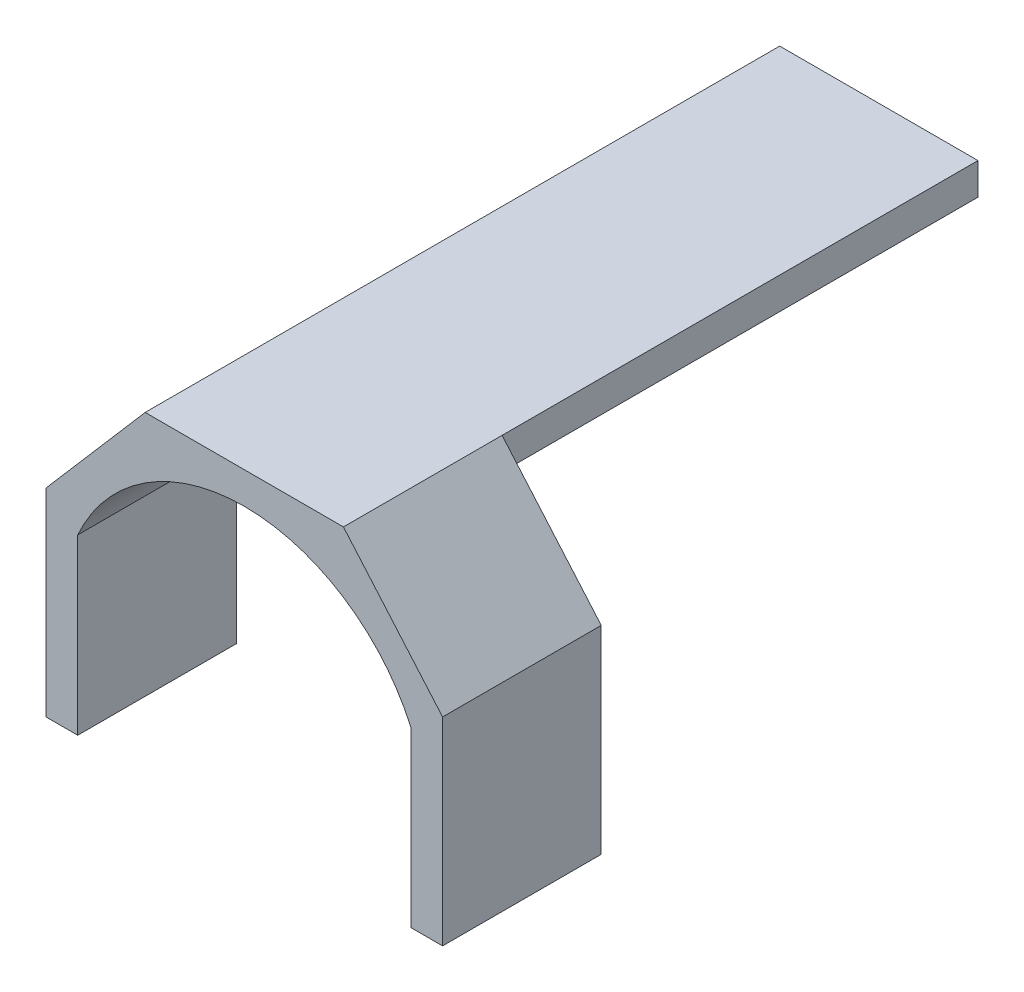
ISO-10303-21;
HEADER;
FILE_DESCRIPTION(('STEP AP214'),'2;1');
FILE_NAME('part.step','',(''),(''),'','','');
FILE_SCHEMA(('AUTOMOTIVE_DESIGN { 1 0 10303 214 1 1 1 1 }'));
ENDSEC;
DATA;
#1=APPLICATION_CONTEXT('core data for automotive mechanical design processes');
#2=APPLICATION_PROTOCOL_DEFINITION('international standard','automotive_design',2000,#1);
#3=PRODUCT_CONTEXT('',#1,'mechanical');
#4=PRODUCT('Part','Part','',(#3));
#5=PRODUCT_RELATED_PRODUCT_CATEGORY('part','',(#4));
#6=PRODUCT_DEFINITION_FORMATION('','',#4);
#7=PRODUCT_DEFINITION_CONTEXT('part definition',#1,'design');
#8=PRODUCT_DEFINITION('design','',#6,#7);
#9=PRODUCT_DEFINITION_SHAPE('','',#8);
#10=(LENGTH_UNIT() NAMED_UNIT(*) SI_UNIT(.MILLI.,.METRE.));
#11=(NAMED_UNIT(*) PLANE_ANGLE_UNIT() SI_UNIT($,.RADIAN.));
#12=(NAMED_UNIT(*) SI_UNIT($,.STERADIAN.) SOLID_ANGLE_UNIT());
#13=UNCERTAINTY_MEASURE_WITH_UNIT(LENGTH_MEASURE(1.E-05),#10,'distance_accuracy_value','');
#14=(GEOMETRIC_REPRESENTATION_CONTEXT(3) GLOBAL_UNCERTAINTY_ASSIGNED_CONTEXT((#13)) GLOBAL_UNIT_ASSIGNED_CONTEXT((#10,
#11,#12)) REPRESENTATION_CONTEXT('',''));
#15=CARTESIAN_POINT('',(0.,0.,0.));
#16=DIRECTION('',(0.,0.,1.));
#17=DIRECTION('',(1.,0.,0.));
#18=AXIS2_PLACEMENT_3D('',#15,#16,#17);
#19=CARTESIAN_POINT('',(-25.,4.,0.));
#20=DIRECTION('',(-1.,0.,0.));
#21=DIRECTION('',(0.,0.,1.));
#22=AXIS2_PLACEMENT_3D('',#19,#20,#21);
#23=PLANE('',#22);
#24=DIRECTION('',(0.,0.,1.));
#25=VECTOR('',#24,1.);
#26=CARTESIAN_POINT('',(-25.,-4.,0.));
#27=LINE('',#26,#25);
#28=CARTESIAN_POINT('',(-25.,-4.,0.));
#29=VERTEX_POINT('',#28);
#30=CARTESIAN_POINT('',(-25.,-4.,120.));
#31=VERTEX_POINT('',#30);
#32=EDGE_CURVE('E161',#29,#31,#27,.T.);
#33=ORIENTED_EDGE('',*,*,#32,.T.);
#34=DIRECTION('',(0.,1.,0.));
#35=VECTOR('',#34,1.);
#36=CARTESIAN_POINT('',(-25.,4.,120.));
#37=LINE('',#36,#35);
#38=CARTESIAN_POINT('',(-25.,4.,120.));
#39=VERTEX_POINT('',#38);
#40=EDGE_CURVE('E149',#31,#39,#37,.T.);
#41=ORIENTED_EDGE('',*,*,#40,.T.);
#42=DIRECTION('',(0.,0.,1.));
#43=VECTOR('',#42,1.);
#44=CARTESIAN_POINT('',(-25.,4.,0.));
#45=LINE('',#44,#43);
#46=CARTESIAN_POINT('',(-25.,4.,0.));
#47=VERTEX_POINT('',#46);
#48=EDGE_CURVE('E159',#47,#39,#45,.T.);
#49=ORIENTED_EDGE('',*,*,#48,.F.);
#50=DIRECTION('',(0.,-1.,0.));
#51=VECTOR('',#50,1.);
#52=CARTESIAN_POINT('',(-25.,4.,0.));
#53=LINE('',#52,#51);
#54=EDGE_CURVE('E69',#47,#29,#53,.T.);
#55=ORIENTED_EDGE('',*,*,#54,.T.);
#56=EDGE_LOOP('',(#33,#41,#49,#55));
#57=FACE_BOUND('',#56,.T.);
#58=ADVANCED_FACE('F35',(#57),#23,.T.);
#59=CARTESIAN_POINT('',(-25.,-4.,0.));
#60=DIRECTION('',(0.,-1.,0.));
#61=DIRECTION('',(1.,0.,0.));
#62=AXIS2_PLACEMENT_3D('',#59,#60,#61);
#63=PLANE('',#62);
#64=DIRECTION('',(0.,0.,1.));
#65=VECTOR('',#64,1.);
#66=CARTESIAN_POINT('',(25.,-4.,0.));
#67=LINE('',#66,#65);
#68=CARTESIAN_POINT('',(25.,-4.,0.));
#69=VERTEX_POINT('',#68);
#70=CARTESIAN_POINT('',(25.,-4.,120.));
#71=VERTEX_POINT('',#70);
#72=EDGE_CURVE('E169',#69,#71,#67,.T.);
#73=ORIENTED_EDGE('',*,*,#72,.T.);
#74=DIRECTION('',(-1.,0.,0.));
#75=VECTOR('',#74,1.);
#76=CARTESIAN_POINT('',(-25.,-4.,120.));
#77=LINE('',#76,#75);
#78=CARTESIAN_POINT('',(0.,-4.,120.));
#79=VERTEX_POINT('',#78);
#80=EDGE_CURVE('E190',#71,#79,#77,.T.);
#81=ORIENTED_EDGE('',*,*,#80,.T.);
#82=EDGE_CURVE('E162',#79,#31,#77,.T.);
#83=ORIENTED_EDGE('',*,*,#82,.T.);
#84=ORIENTED_EDGE('',*,*,#32,.F.);
#85=DIRECTION('',(1.,0.,0.));
#86=VECTOR('',#85,1.);
#87=CARTESIAN_POINT('',(-25.,-4.,0.));
#88=LINE('',#87,#86);
#89=EDGE_CURVE('E66',#29,#69,#88,.T.);
#90=ORIENTED_EDGE('',*,*,#89,.T.);
#91=EDGE_LOOP('',(#73,#81,#83,#84,#90));
#92=FACE_BOUND('',#91,.T.);
#93=ADVANCED_FACE('F212',(#92),#63,.T.);
#94=CARTESIAN_POINT('',(25.,4.,0.));
#95=DIRECTION('',(1.,0.,0.));
#96=DIRECTION('',(0.,0.,-1.));
#97=AXIS2_PLACEMENT_3D('',#94,#95,#96);
#98=PLANE('',#97);
#99=DIRECTION('',(0.,0.,1.));
#100=VECTOR('',#99,1.);
#101=CARTESIAN_POINT('',(25.,4.,0.));
#102=LINE('',#101,#100);
#103=CARTESIAN_POINT('',(25.,4.,0.));
#104=VERTEX_POINT('',#103);
#105=CARTESIAN_POINT('',(25.,4.,120.));
#106=VERTEX_POINT('',#105);
#107=EDGE_CURVE('E44',#104,#106,#102,.T.);
#108=ORIENTED_EDGE('',*,*,#107,.T.);
#109=DIRECTION('',(0.,-1.,0.));
#110=VECTOR('',#109,1.);
#111=CARTESIAN_POINT('',(25.,4.,120.));
#112=LINE('',#111,#110);
#113=EDGE_CURVE('E182',#106,#71,#112,.T.);
#114=ORIENTED_EDGE('',*,*,#113,.T.);
#115=ORIENTED_EDGE('',*,*,#72,.F.);
#116=DIRECTION('',(0.,1.,0.));
#117=VECTOR('',#116,1.);
#118=CARTESIAN_POINT('',(25.,4.,0.));
#119=LINE('',#118,#117);
#120=EDGE_CURVE('E62',#69,#104,#119,.T.);
#121=ORIENTED_EDGE('',*,*,#120,.T.);
#122=EDGE_LOOP('',(#108,#114,#115,#121));
#123=FACE_BOUND('',#122,.T.);
#124=ADVANCED_FACE('F180',(#123),#98,.T.);
#125=CARTESIAN_POINT('',(0.,0.,0.));
#126=DIRECTION('',(0.,0.,1.));
#127=DIRECTION('',(1.,0.,0.));
#128=AXIS2_PLACEMENT_3D('',#125,#126,#127);
#129=PLANE('',#128);
#130=ORIENTED_EDGE('',*,*,#54,.F.);
#131=DIRECTION('',(-1.,0.,0.));
#132=VECTOR('',#131,1.);
#133=CARTESIAN_POINT('',(-25.,4.,0.));
#134=LINE('',#133,#132);
#135=EDGE_CURVE('E167',#104,#47,#134,.T.);
#136=ORIENTED_EDGE('',*,*,#135,.F.);
#137=ORIENTED_EDGE('',*,*,#120,.F.);
#138=ORIENTED_EDGE('',*,*,#89,.F.);
#139=EDGE_LOOP('',(#130,#136,#137,#138));
#140=FACE_BOUND('',#139,.T.);
#141=ADVANCED_FACE('F37',(#140),#129,.F.);
#142=CARTESIAN_POINT('',(0.,0.,160.));
#143=DIRECTION('',(0.,0.,1.));
#144=DIRECTION('',(1.,0.,0.));
#145=AXIS2_PLACEMENT_3D('',#142,#143,#144);
#146=PLANE('',#145);
#147=CARTESIAN_POINT('',(0.,-50.,160.));
#148=DIRECTION('',(0.,0.,-1.));
#149=DIRECTION('',(1.,0.,0.));
#150=AXIS2_PLACEMENT_3D('',#147,#148,#149);
#151=CIRCLE('',#150,46.);
#152=CARTESIAN_POINT('',(-42.,-31.2383369607063,160.));
#153=VERTEX_POINT('',#152);
#154=CARTESIAN_POINT('',(42.,-31.2383369607063,160.));
#155=VERTEX_POINT('',#154);
#156=EDGE_CURVE('E253',#153,#155,#151,.T.);
#157=ORIENTED_EDGE('',*,*,#156,.T.);
#158=DIRECTION('',(0.,-1.,0.));
#159=VECTOR('',#158,1.);
#160=CARTESIAN_POINT('',(42.,-31.2383369607063,160.));
#161=LINE('',#160,#159);
#162=CARTESIAN_POINT('',(42.,-75.,160.));
#163=VERTEX_POINT('',#162);
#164=EDGE_CURVE('E255',#155,#163,#161,.T.);
#165=ORIENTED_EDGE('',*,*,#164,.T.);
#166=DIRECTION('',(1.,0.,0.));
#167=VECTOR('',#166,1.);
#168=CARTESIAN_POINT('',(42.,-75.,160.));
#169=LINE('',#168,#167);
#170=CARTESIAN_POINT('',(50.,-75.,160.));
#171=VERTEX_POINT('',#170);
#172=EDGE_CURVE('E258',#163,#171,#169,.T.);
#173=ORIENTED_EDGE('',*,*,#172,.T.);
#174=DIRECTION('',(0.,1.,0.));
#175=VECTOR('',#174,1.);
#176=CARTESIAN_POINT('',(50.,-25.,160.));
#177=LINE('',#176,#175);
#178=CARTESIAN_POINT('',(50.,-25.,160.));
#179=VERTEX_POINT('',#178);
#180=EDGE_CURVE('E260',#171,#179,#177,.T.);
#181=ORIENTED_EDGE('',*,*,#180,.T.);
#182=DIRECTION('',(-0.652939622069463,0.757409961600577,0.));
#183=VECTOR('',#182,1.);
#184=CARTESIAN_POINT('',(25.,4.,160.));
#185=LINE('',#184,#183);
#186=CARTESIAN_POINT('',(25.,4.,160.));
#187=VERTEX_POINT('',#186);
#188=EDGE_CURVE('E154',#179,#187,#185,.T.);
#189=ORIENTED_EDGE('',*,*,#188,.T.);
#190=DIRECTION('',(-1.,0.,0.));
#191=VECTOR('',#190,1.);
#192=CARTESIAN_POINT('',(-25.,4.,160.));
#193=LINE('',#192,#191);
#194=CARTESIAN_POINT('',(-25.,4.,160.));
#195=VERTEX_POINT('',#194);
#196=EDGE_CURVE('E11',#187,#195,#193,.T.);
#197=ORIENTED_EDGE('',*,*,#196,.T.);
#198=DIRECTION('',(-0.652939622069463,-0.757409961600577,0.));
#199=VECTOR('',#198,1.);
#200=CARTESIAN_POINT('',(-50.,-25.,160.));
#201=LINE('',#200,#199);
#202=CARTESIAN_POINT('',(-50.,-25.,160.));
#203=VERTEX_POINT('',#202);
#204=EDGE_CURVE('E51',#195,#203,#201,.T.);
#205=ORIENTED_EDGE('',*,*,#204,.T.);
#206=DIRECTION('',(0.,-1.,0.));
#207=VECTOR('',#206,1.);
#208=CARTESIAN_POINT('',(-50.,-25.,160.));
#209=LINE('',#208,#207);
#210=CARTESIAN_POINT('',(-50.,-75.,160.));
#211=VERTEX_POINT('',#210);
#212=EDGE_CURVE('E244',#203,#211,#209,.T.);
#213=ORIENTED_EDGE('',*,*,#212,.T.);
#214=DIRECTION('',(1.,0.,0.));
#215=VECTOR('',#214,1.);
#216=CARTESIAN_POINT('',(-50.,-75.,160.));
#217=LINE('',#216,#215);
#218=CARTESIAN_POINT('',(-42.,-75.,160.));
#219=VERTEX_POINT('',#218);
#220=EDGE_CURVE('E247',#211,#219,#217,.T.);
#221=ORIENTED_EDGE('',*,*,#220,.T.);
#222=DIRECTION('',(0.,1.,0.));
#223=VECTOR('',#222,1.);
#224=CARTESIAN_POINT('',(-42.,-31.2383369607063,160.));
#225=LINE('',#224,#223);
#226=EDGE_CURVE('E250',#219,#153,#225,.T.);
#227=ORIENTED_EDGE('',*,*,#226,.T.);
#228=EDGE_LOOP('',(#157,#165,#173,#181,#189,#197,#205,#213,#221,#227));
#229=FACE_BOUND('',#228,.T.);
#230=ADVANCED_FACE('F264',(#229),#146,.T.);
#231=CARTESIAN_POINT('',(-25.,4.,0.));
#232=DIRECTION('',(0.,1.,0.));
#233=DIRECTION('',(0.,0.,1.));
#234=AXIS2_PLACEMENT_3D('',#231,#232,#233);
#235=PLANE('',#234);
#236=DIRECTION('',(0.,0.,1.));
#237=VECTOR('',#236,1.);
#238=CARTESIAN_POINT('',(25.,4.,120.));
#239=LINE('',#238,#237);
#240=EDGE_CURVE('E183',#106,#187,#239,.T.);
#241=ORIENTED_EDGE('',*,*,#240,.F.);
#242=ORIENTED_EDGE('',*,*,#107,.F.);
#243=ORIENTED_EDGE('',*,*,#135,.T.);
#244=ORIENTED_EDGE('',*,*,#48,.T.);
#245=DIRECTION('',(0.,0.,1.));
#246=VECTOR('',#245,1.);
#247=CARTESIAN_POINT('',(-25.,4.,120.));
#248=LINE('',#247,#246);
#249=EDGE_CURVE('E135',#39,#195,#248,.T.);
#250=ORIENTED_EDGE('',*,*,#249,.T.);
#251=ORIENTED_EDGE('',*,*,#196,.F.);
#252=EDGE_LOOP('',(#241,#242,#243,#244,#250,#251));
#253=FACE_BOUND('',#252,.T.);
#254=ADVANCED_FACE('F165',(#253),#235,.T.);
#255=CARTESIAN_POINT('',(0.,-50.,120.));
#256=DIRECTION('',(0.,0.,1.));
#257=DIRECTION('',(1.,0.,0.));
#258=AXIS2_PLACEMENT_3D('',#255,#256,#257);
#259=CYLINDRICAL_SURFACE('',#258,46.);
#260=CARTESIAN_POINT('',(0.,-50.,120.));
#261=DIRECTION('',(0.,0.,-1.));
#262=DIRECTION('',(1.,0.,0.));
#263=AXIS2_PLACEMENT_3D('',#260,#261,#262);
#264=CIRCLE('',#263,46.);
#265=CARTESIAN_POINT('',(-42.,-31.2383369607063,120.));
#266=VERTEX_POINT('',#265);
#267=EDGE_CURVE('E217',#266,#79,#264,.T.);
#268=ORIENTED_EDGE('',*,*,#267,.T.);
#269=CARTESIAN_POINT('',(42.,-31.2383369607063,120.));
#270=VERTEX_POINT('',#269);
#271=EDGE_CURVE('E221',#79,#270,#264,.T.);
#272=ORIENTED_EDGE('',*,*,#271,.T.);
#273=DIRECTION('',(0.,0.,1.));
#274=VECTOR('',#273,1.);
#275=CARTESIAN_POINT('',(42.,-31.2383369607063,120.));
#276=LINE('',#275,#274);
#277=EDGE_CURVE('E200',#270,#155,#276,.T.);
#278=ORIENTED_EDGE('',*,*,#277,.T.);
#279=ORIENTED_EDGE('',*,*,#156,.F.);
#280=DIRECTION('',(0.,0.,1.));
#281=VECTOR('',#280,1.);
#282=CARTESIAN_POINT('',(-42.,-31.2383369607063,120.));
#283=LINE('',#282,#281);
#284=EDGE_CURVE('E203',#266,#153,#283,.T.);
#285=ORIENTED_EDGE('',*,*,#284,.F.);
#286=EDGE_LOOP('',(#268,#272,#278,#279,#285));
#287=FACE_BOUND('',#286,.T.);
#288=ADVANCED_FACE('F230',(#287),#259,.F.);
#289=CARTESIAN_POINT('',(0.,-50.,120.));
#290=DIRECTION('',(0.,0.,1.));
#291=DIRECTION('',(1.,0.,0.));
#292=AXIS2_PLACEMENT_3D('',#289,#290,#291);
#293=PLANE('',#292);
#294=ORIENTED_EDGE('',*,*,#40,.F.);
#295=ORIENTED_EDGE('',*,*,#82,.F.);
#296=ORIENTED_EDGE('',*,*,#267,.F.);
#297=DIRECTION('',(0.,1.,0.));
#298=VECTOR('',#297,1.);
#299=CARTESIAN_POINT('',(-42.,-31.2383369607063,120.));
#300=LINE('',#299,#298);
#301=CARTESIAN_POINT('',(-42.,-75.,120.));
#302=VERTEX_POINT('',#301);
#303=EDGE_CURVE('E228',#302,#266,#300,.T.);
#304=ORIENTED_EDGE('',*,*,#303,.F.);
#305=DIRECTION('',(1.,0.,0.));
#306=VECTOR('',#305,1.);
#307=CARTESIAN_POINT('',(-50.,-75.,120.));
#308=LINE('',#307,#306);
#309=CARTESIAN_POINT('',(-50.,-75.,120.));
#310=VERTEX_POINT('',#309);
#311=EDGE_CURVE('E281',#310,#302,#308,.T.);
#312=ORIENTED_EDGE('',*,*,#311,.F.);
#313=DIRECTION('',(0.,-1.,0.));
#314=VECTOR('',#313,1.);
#315=CARTESIAN_POINT('',(-50.,-25.,120.));
#316=LINE('',#315,#314);
#317=CARTESIAN_POINT('',(-50.,-25.,120.));
#318=VERTEX_POINT('',#317);
#319=EDGE_CURVE('E153',#318,#310,#316,.T.);
#320=ORIENTED_EDGE('',*,*,#319,.F.);
#321=DIRECTION('',(-0.652939622069463,-0.757409961600577,0.));
#322=VECTOR('',#321,1.);
#323=CARTESIAN_POINT('',(-50.,-25.,120.));
#324=LINE('',#323,#322);
#325=EDGE_CURVE('E138',#39,#318,#324,.T.);
#326=ORIENTED_EDGE('',*,*,#325,.F.);
#327=EDGE_LOOP('',(#294,#295,#296,#304,#312,#320,#326));
#328=FACE_BOUND('',#327,.T.);
#329=ADVANCED_FACE('F148',(#328),#293,.F.);
#330=CARTESIAN_POINT('',(25.,4.,120.));
#331=DIRECTION('',(0.757409961600577,0.652939622069463,0.));
#332=DIRECTION('',(-0.652939622069463,0.757409961600577,0.));
#333=AXIS2_PLACEMENT_3D('',#330,#331,#332);
#334=PLANE('',#333);
#335=ORIENTED_EDGE('',*,*,#188,.F.);
#336=DIRECTION('',(0.,0.,1.));
#337=VECTOR('',#336,1.);
#338=CARTESIAN_POINT('',(50.,-25.,120.));
#339=LINE('',#338,#337);
#340=CARTESIAN_POINT('',(50.,-25.,120.));
#341=VERTEX_POINT('',#340);
#342=EDGE_CURVE('E188',#341,#179,#339,.T.);
#343=ORIENTED_EDGE('',*,*,#342,.F.);
#344=DIRECTION('',(-0.652939622069463,0.757409961600577,0.));
#345=VECTOR('',#344,1.);
#346=CARTESIAN_POINT('',(25.,4.,120.));
#347=LINE('',#346,#345);
#348=EDGE_CURVE('E143',#341,#106,#347,.T.);
#349=ORIENTED_EDGE('',*,*,#348,.T.);
#350=ORIENTED_EDGE('',*,*,#240,.T.);
#351=EDGE_LOOP('',(#335,#343,#349,#350));
#352=FACE_BOUND('',#351,.T.);
#353=ADVANCED_FACE('F265',(#352),#334,.T.);
#354=CARTESIAN_POINT('',(50.,-25.,120.));
#355=DIRECTION('',(1.,0.,0.));
#356=DIRECTION('',(0.,1.,0.));
#357=AXIS2_PLACEMENT_3D('',#354,#355,#356);
#358=PLANE('',#357);
#359=ORIENTED_EDGE('',*,*,#180,.F.);
#360=DIRECTION('',(0.,0.,1.));
#361=VECTOR('',#360,1.);
#362=CARTESIAN_POINT('',(50.,-75.,120.));
#363=LINE('',#362,#361);
#364=CARTESIAN_POINT('',(50.,-75.,120.));
#365=VERTEX_POINT('',#364);
#366=EDGE_CURVE('E192',#365,#171,#363,.T.);
#367=ORIENTED_EDGE('',*,*,#366,.F.);
#368=DIRECTION('',(0.,1.,0.));
#369=VECTOR('',#368,1.);
#370=CARTESIAN_POINT('',(50.,-25.,120.));
#371=LINE('',#370,#369);
#372=EDGE_CURVE('E239',#365,#341,#371,.T.);
#373=ORIENTED_EDGE('',*,*,#372,.T.);
#374=ORIENTED_EDGE('',*,*,#342,.T.);
#375=EDGE_LOOP('',(#359,#367,#373,#374));
#376=FACE_BOUND('',#375,.T.);
#377=ADVANCED_FACE('F269',(#376),#358,.T.);
#378=CARTESIAN_POINT('',(42.,-75.,120.));
#379=DIRECTION('',(0.,-1.,0.));
#380=DIRECTION('',(0.,0.,-1.));
#381=AXIS2_PLACEMENT_3D('',#378,#379,#380);
#382=PLANE('',#381);
#383=ORIENTED_EDGE('',*,*,#172,.F.);
#384=DIRECTION('',(0.,0.,1.));
#385=VECTOR('',#384,1.);
#386=CARTESIAN_POINT('',(42.,-75.,120.));
#387=LINE('',#386,#385);
#388=CARTESIAN_POINT('',(42.,-75.,120.));
#389=VERTEX_POINT('',#388);
#390=EDGE_CURVE('E198',#389,#163,#387,.T.);
#391=ORIENTED_EDGE('',*,*,#390,.F.);
#392=DIRECTION('',(1.,0.,0.));
#393=VECTOR('',#392,1.);
#394=CARTESIAN_POINT('',(42.,-75.,120.));
#395=LINE('',#394,#393);
#396=EDGE_CURVE('E232',#389,#365,#395,.T.);
#397=ORIENTED_EDGE('',*,*,#396,.T.);
#398=ORIENTED_EDGE('',*,*,#366,.T.);
#399=EDGE_LOOP('',(#383,#391,#397,#398));
#400=FACE_BOUND('',#399,.T.);
#401=ADVANCED_FACE('F272',(#400),#382,.T.);
#402=CARTESIAN_POINT('',(42.,-31.2383369607063,120.));
#403=DIRECTION('',(-1.,0.,0.));
#404=DIRECTION('',(0.,-1.,0.));
#405=AXIS2_PLACEMENT_3D('',#402,#403,#404);
#406=PLANE('',#405);
#407=ORIENTED_EDGE('',*,*,#164,.F.);
#408=ORIENTED_EDGE('',*,*,#277,.F.);
#409=DIRECTION('',(0.,-1.,0.));
#410=VECTOR('',#409,1.);
#411=CARTESIAN_POINT('',(42.,-31.2383369607063,120.));
#412=LINE('',#411,#410);
#413=EDGE_CURVE('E225',#270,#389,#412,.T.);
#414=ORIENTED_EDGE('',*,*,#413,.T.);
#415=ORIENTED_EDGE('',*,*,#390,.T.);
#416=EDGE_LOOP('',(#407,#408,#414,#415));
#417=FACE_BOUND('',#416,.T.);
#418=ADVANCED_FACE('F275',(#417),#406,.T.);
#419=CARTESIAN_POINT('',(-42.,-31.2383369607063,120.));
#420=DIRECTION('',(1.,0.,0.));
#421=DIRECTION('',(0.,1.,0.));
#422=AXIS2_PLACEMENT_3D('',#419,#420,#421);
#423=PLANE('',#422);
#424=ORIENTED_EDGE('',*,*,#226,.F.);
#425=DIRECTION('',(0.,0.,1.));
#426=VECTOR('',#425,1.);
#427=CARTESIAN_POINT('',(-42.,-75.,120.));
#428=LINE('',#427,#426);
#429=EDGE_CURVE('E205',#302,#219,#428,.T.);
#430=ORIENTED_EDGE('',*,*,#429,.F.);
#431=ORIENTED_EDGE('',*,*,#303,.T.);
#432=ORIENTED_EDGE('',*,*,#284,.T.);
#433=EDGE_LOOP('',(#424,#430,#431,#432));
#434=FACE_BOUND('',#433,.T.);
#435=ADVANCED_FACE('F279',(#434),#423,.T.);
#436=CARTESIAN_POINT('',(-50.,-75.,120.));
#437=DIRECTION('',(0.,-1.,0.));
#438=DIRECTION('',(0.,0.,-1.));
#439=AXIS2_PLACEMENT_3D('',#436,#437,#438);
#440=PLANE('',#439);
#441=ORIENTED_EDGE('',*,*,#220,.F.);
#442=DIRECTION('',(0.,0.,1.));
#443=VECTOR('',#442,1.);
#444=CARTESIAN_POINT('',(-50.,-75.,120.));
#445=LINE('',#444,#443);
#446=EDGE_CURVE('E207',#310,#211,#445,.T.);
#447=ORIENTED_EDGE('',*,*,#446,.F.);
#448=ORIENTED_EDGE('',*,*,#311,.T.);
#449=ORIENTED_EDGE('',*,*,#429,.T.);
#450=EDGE_LOOP('',(#441,#447,#448,#449));
#451=FACE_BOUND('',#450,.T.);
#452=ADVANCED_FACE('F287',(#451),#440,.T.);
#453=CARTESIAN_POINT('',(-50.,-25.,120.));
#454=DIRECTION('',(-1.,0.,0.));
#455=DIRECTION('',(0.,-1.,0.));
#456=AXIS2_PLACEMENT_3D('',#453,#454,#455);
#457=PLANE('',#456);
#458=ORIENTED_EDGE('',*,*,#212,.F.);
#459=DIRECTION('',(0.,0.,1.));
#460=VECTOR('',#459,1.);
#461=CARTESIAN_POINT('',(-50.,-25.,120.));
#462=LINE('',#461,#460);
#463=EDGE_CURVE('E142',#318,#203,#462,.T.);
#464=ORIENTED_EDGE('',*,*,#463,.F.);
#465=ORIENTED_EDGE('',*,*,#319,.T.);
#466=ORIENTED_EDGE('',*,*,#446,.T.);
#467=EDGE_LOOP('',(#458,#464,#465,#466));
#468=FACE_BOUND('',#467,.T.);
#469=ADVANCED_FACE('F286',(#468),#457,.T.);
#470=CARTESIAN_POINT('',(-50.,-25.,120.));
#471=DIRECTION('',(-0.757409961600577,0.652939622069463,0.));
#472=DIRECTION('',(-0.652939622069463,-0.757409961600577,0.));
#473=AXIS2_PLACEMENT_3D('',#470,#471,#472);
#474=PLANE('',#473);
#475=ORIENTED_EDGE('',*,*,#204,.F.);
#476=ORIENTED_EDGE('',*,*,#249,.F.);
#477=ORIENTED_EDGE('',*,*,#325,.T.);
#478=ORIENTED_EDGE('',*,*,#463,.T.);
#479=EDGE_LOOP('',(#475,#476,#477,#478));
#480=FACE_BOUND('',#479,.T.);
#481=ADVANCED_FACE('F137',(#480),#474,.T.);
#482=ORIENTED_EDGE('',*,*,#80,.F.);
#483=ORIENTED_EDGE('',*,*,#113,.F.);
#484=ORIENTED_EDGE('',*,*,#348,.F.);
#485=ORIENTED_EDGE('',*,*,#372,.F.);
#486=ORIENTED_EDGE('',*,*,#396,.F.);
#487=ORIENTED_EDGE('',*,*,#413,.F.);
#488=ORIENTED_EDGE('',*,*,#271,.F.);
#489=EDGE_LOOP('',(#482,#483,#484,#485,#486,#487,#488));
#490=FACE_BOUND('',#489,.T.);
#491=ADVANCED_FACE('F222',(#490),#293,.F.);
#492=CLOSED_SHELL('',(#58,#93,#124,#141,#230,#254,#288,#329,#353,#377,#401,#418,#435,#452,#469,
#481,#491));
#493=MANIFOLD_SOLID_BREP('B2',#492);
#494=ADVANCED_BREP_SHAPE_REPRESENTATION('',(#18,#493),#14);
#495=SHAPE_DEFINITION_REPRESENTATION(#9,#494);
ENDSEC;
END-ISO-10303-21;
